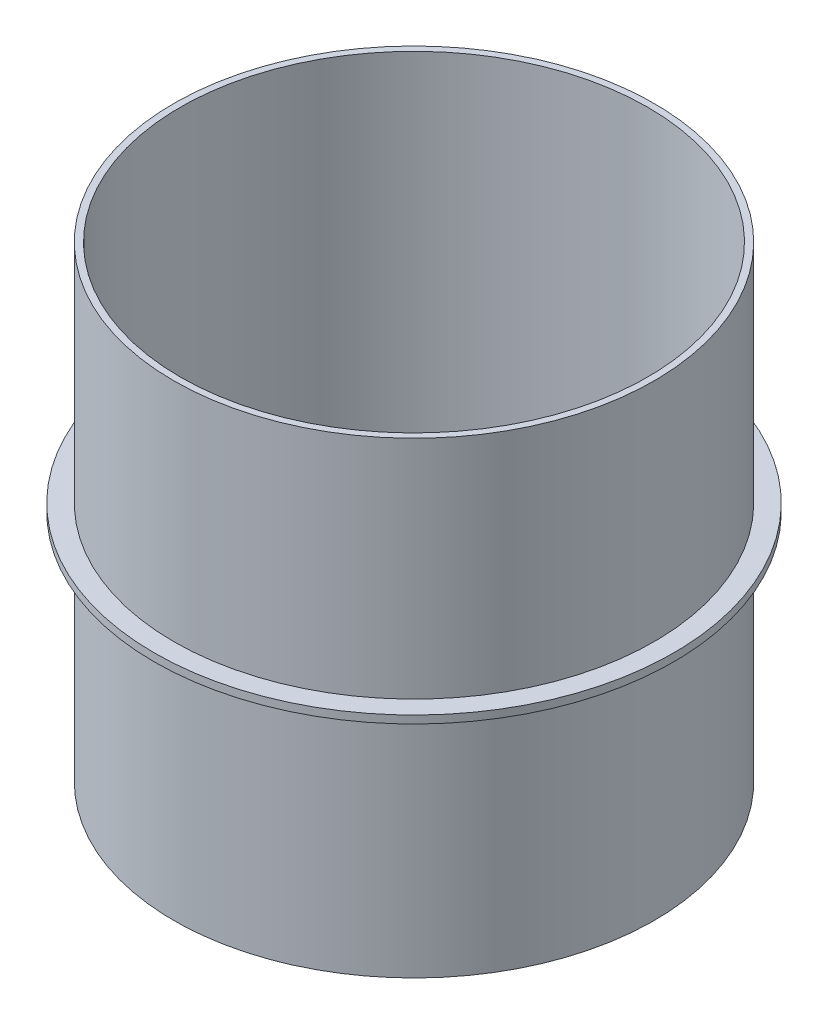
ISO-10303-21;
HEADER;
FILE_DESCRIPTION(('STEP AP214'),'2;1');
FILE_NAME('part.step','',(''),(''),'','','');
FILE_SCHEMA(('AUTOMOTIVE_DESIGN { 1 0 10303 214 1 1 1 1 }'));
ENDSEC;
DATA;
#1=APPLICATION_CONTEXT('core data for automotive mechanical design processes');
#2=APPLICATION_PROTOCOL_DEFINITION('international standard','automotive_design',2000,#1);
#3=PRODUCT_CONTEXT('',#1,'mechanical');
#4=PRODUCT('Part','Part','',(#3));
#5=PRODUCT_RELATED_PRODUCT_CATEGORY('part','',(#4));
#6=PRODUCT_DEFINITION_FORMATION('','',#4);
#7=PRODUCT_DEFINITION_CONTEXT('part definition',#1,'design');
#8=PRODUCT_DEFINITION('design','',#6,#7);
#9=PRODUCT_DEFINITION_SHAPE('','',#8);
#10=(LENGTH_UNIT() NAMED_UNIT(*) SI_UNIT(.MILLI.,.METRE.));
#11=(NAMED_UNIT(*) PLANE_ANGLE_UNIT() SI_UNIT($,.RADIAN.));
#12=(NAMED_UNIT(*) SI_UNIT($,.STERADIAN.) SOLID_ANGLE_UNIT());
#13=UNCERTAINTY_MEASURE_WITH_UNIT(LENGTH_MEASURE(1.E-05),#10,'distance_accuracy_value','');
#14=(GEOMETRIC_REPRESENTATION_CONTEXT(3) GLOBAL_UNCERTAINTY_ASSIGNED_CONTEXT((#13)) GLOBAL_UNIT_ASSIGNED_CONTEXT((#10,
#11,#12)) REPRESENTATION_CONTEXT('',''));
#15=CARTESIAN_POINT('',(0.,0.,0.));
#16=DIRECTION('',(0.,0.,1.));
#17=DIRECTION('',(1.,0.,0.));
#18=AXIS2_PLACEMENT_3D('',#15,#16,#17);
#19=CARTESIAN_POINT('',(0.,0.,0.));
#20=DIRECTION('',(0.,1.,0.));
#21=DIRECTION('',(0.,0.,1.));
#22=AXIS2_PLACEMENT_3D('',#19,#20,#21);
#23=PLANE('',#22);
#24=CARTESIAN_POINT('',(0.,0.,0.));
#25=DIRECTION('',(0.,1.,0.));
#26=DIRECTION('',(0.,0.,1.));
#27=AXIS2_PLACEMENT_3D('',#24,#25,#26);
#28=CIRCLE('',#27,92.5);
#29=CARTESIAN_POINT('',(0.,0.,-92.5));
#30=VERTEX_POINT('',#29);
#31=EDGE_CURVE('E47',#30,#30,#28,.T.);
#32=ORIENTED_EDGE('',*,*,#31,.F.);
#33=EDGE_LOOP('',(#32));
#34=FACE_BOUND('',#33,.T.);
#35=CARTESIAN_POINT('',(0.,0.,0.));
#36=DIRECTION('',(0.,1.,0.));
#37=DIRECTION('',(0.,0.,1.));
#38=AXIS2_PLACEMENT_3D('',#35,#36,#37);
#39=CIRCLE('',#38,90.);
#40=CARTESIAN_POINT('',(0.,0.,-90.));
#41=VERTEX_POINT('',#40);
#42=EDGE_CURVE('E66',#41,#41,#39,.T.);
#43=ORIENTED_EDGE('',*,*,#42,.T.);
#44=EDGE_LOOP('',(#43));
#45=FACE_BOUND('',#44,.T.);
#46=ADVANCED_FACE('F43',(#34,#45),#23,.F.);
#47=CARTESIAN_POINT('',(0.,90.,0.));
#48=DIRECTION('',(0.,-1.,0.));
#49=DIRECTION('',(0.,0.,-1.));
#50=AXIS2_PLACEMENT_3D('',#47,#48,#49);
#51=CYLINDRICAL_SURFACE('',#50,92.5);
#52=CARTESIAN_POINT('',(0.,90.,0.));
#53=DIRECTION('',(0.,1.,0.));
#54=DIRECTION('',(0.,0.,1.));
#55=AXIS2_PLACEMENT_3D('',#52,#53,#54);
#56=CIRCLE('',#55,92.5);
#57=CARTESIAN_POINT('',(0.,90.,-92.5));
#58=VERTEX_POINT('',#57);
#59=EDGE_CURVE('E52',#58,#58,#56,.T.);
#60=CARTESIAN_POINT('',(0.,90.,-92.5));
#61=CARTESIAN_POINT('',(0.,89.0625,-92.5));
#62=CARTESIAN_POINT('',(0.,88.125,-92.5));
#63=CARTESIAN_POINT('',(0.,86.25,-92.5));
#64=CARTESIAN_POINT('',(0.,85.3125,-92.5));
#65=CARTESIAN_POINT('',(0.,83.4375,-92.5));
#66=CARTESIAN_POINT('',(0.,82.5,-92.5));
#67=CARTESIAN_POINT('',(0.,80.625,-92.5));
#68=CARTESIAN_POINT('',(0.,79.6875,-92.5));
#69=CARTESIAN_POINT('',(0.,77.8125,-92.5));
#70=CARTESIAN_POINT('',(0.,76.875,-92.5));
#71=CARTESIAN_POINT('',(0.,75.,-92.5));
#72=CARTESIAN_POINT('',(0.,74.0625,-92.5));
#73=CARTESIAN_POINT('',(0.,72.1875,-92.5));
#74=CARTESIAN_POINT('',(0.,71.25,-92.5));
#75=CARTESIAN_POINT('',(0.,69.375,-92.5));
#76=CARTESIAN_POINT('',(0.,68.4375,-92.5));
#77=CARTESIAN_POINT('',(0.,66.5625,-92.5));
#78=CARTESIAN_POINT('',(0.,65.625,-92.5));
#79=CARTESIAN_POINT('',(0.,63.75,-92.5));
#80=CARTESIAN_POINT('',(0.,62.8125,-92.5));
#81=CARTESIAN_POINT('',(0.,60.9375,-92.5));
#82=CARTESIAN_POINT('',(0.,60.,-92.5));
#83=CARTESIAN_POINT('',(0.,58.125,-92.5));
#84=CARTESIAN_POINT('',(0.,57.1875,-92.5));
#85=CARTESIAN_POINT('',(0.,55.3125,-92.5));
#86=CARTESIAN_POINT('',(0.,54.375,-92.5));
#87=CARTESIAN_POINT('',(0.,52.5,-92.5));
#88=CARTESIAN_POINT('',(0.,51.5625,-92.5));
#89=CARTESIAN_POINT('',(0.,49.6875,-92.5));
#90=CARTESIAN_POINT('',(0.,48.75,-92.5));
#91=CARTESIAN_POINT('',(0.,46.875,-92.5));
#92=CARTESIAN_POINT('',(0.,45.9375,-92.5));
#93=CARTESIAN_POINT('',(0.,44.0625,-92.5));
#94=CARTESIAN_POINT('',(0.,43.125,-92.5));
#95=CARTESIAN_POINT('',(0.,41.25,-92.5));
#96=CARTESIAN_POINT('',(0.,40.3125,-92.5));
#97=CARTESIAN_POINT('',(0.,38.4375,-92.5));
#98=CARTESIAN_POINT('',(0.,37.5,-92.5));
#99=CARTESIAN_POINT('',(0.,35.625,-92.5));
#100=CARTESIAN_POINT('',(0.,34.6875,-92.5));
#101=CARTESIAN_POINT('',(0.,32.8125,-92.5));
#102=CARTESIAN_POINT('',(0.,31.875,-92.5));
#103=CARTESIAN_POINT('',(0.,30.,-92.5));
#104=CARTESIAN_POINT('',(0.,29.0625,-92.5));
#105=CARTESIAN_POINT('',(0.,27.1875,-92.5));
#106=CARTESIAN_POINT('',(0.,26.25,-92.5));
#107=CARTESIAN_POINT('',(0.,24.375,-92.5));
#108=CARTESIAN_POINT('',(0.,23.4375,-92.5));
#109=CARTESIAN_POINT('',(0.,21.5625,-92.5));
#110=CARTESIAN_POINT('',(0.,20.625,-92.5));
#111=CARTESIAN_POINT('',(0.,18.75,-92.5));
#112=CARTESIAN_POINT('',(0.,17.8125,-92.5));
#113=CARTESIAN_POINT('',(0.,15.9375,-92.5));
#114=CARTESIAN_POINT('',(0.,15.,-92.5));
#115=CARTESIAN_POINT('',(0.,13.125,-92.5));
#116=CARTESIAN_POINT('',(0.,12.1875,-92.5));
#117=CARTESIAN_POINT('',(0.,10.3125,-92.5));
#118=CARTESIAN_POINT('',(0.,9.37499999999999,-92.5));
#119=CARTESIAN_POINT('',(0.,7.49999999999999,-92.5));
#120=CARTESIAN_POINT('',(0.,6.56249999999999,-92.5));
#121=CARTESIAN_POINT('',(0.,4.68749999999999,-92.5));
#122=CARTESIAN_POINT('',(0.,3.74999999999998,-92.5));
#123=CARTESIAN_POINT('',(0.,1.87499999999998,-92.5));
#124=CARTESIAN_POINT('',(0.,0.937499999999986,-92.5));
#125=CARTESIAN_POINT('',(0.,0.,-92.5));
#126=B_SPLINE_CURVE_WITH_KNOTS('',3,(#60,#61,#62,#63,#64,#65,#66,#67,#68,#69,#70,#71,#72,#73,
#74,#75,#76,#77,#78,#79,#80,#81,#82,#83,#84,#85,#86,#87,#88,#89,#90,#91,#92,#93,#94,#95,#96,#97,
#98,#99,#100,#101,#102,#103,#104,#105,#106,#107,#108,#109,#110,#111,#112,#113,#114,#115,#116,
#117,#118,#119,#120,#121,#122,#123,#124,#125),.UNSPECIFIED.,.F.,.F.,(4,2,2,2,2,2,2,2,2,2,2,2,2,
2,2,2,2,2,2,2,2,2,2,2,2,2,2,2,2,2,2,2,4),(0.,2.8125,5.62499999999999,8.43749999999999,11.25,
14.0625,16.875,19.6875,22.5,25.3125,28.125,30.9375,33.75,36.5625,39.375,42.1875,45.,47.8125,
50.625,53.4375,56.25,59.0625,61.875,64.6875,67.5,70.3125,73.125,75.9375,78.75,81.5625,84.375,
87.1875,90.),.UNSPECIFIED.);
#127=EDGE_CURVE('BSEAM45',#58,#30,#126,.T.);
#128=ORIENTED_EDGE('',*,*,#59,.F.);
#129=ORIENTED_EDGE('',*,*,#31,.T.);
#130=ORIENTED_EDGE('',*,*,#127,.T.);
#131=ORIENTED_EDGE('',*,*,#127,.F.);
#132=EDGE_LOOP('',(#128,#130,#129,#131));
#133=FACE_BOUND('',#132,.T.);
#134=ADVANCED_FACE('F45',(#133),#51,.T.);
#135=CARTESIAN_POINT('',(0.,90.,0.));
#136=DIRECTION('',(0.,-1.,0.));
#137=DIRECTION('',(0.,0.,-1.));
#138=AXIS2_PLACEMENT_3D('',#135,#136,#137);
#139=CYLINDRICAL_SURFACE('',#138,90.);
#140=CARTESIAN_POINT('',(0.,180.,0.));
#141=DIRECTION('',(0.,1.,0.));
#142=DIRECTION('',(0.,0.,1.));
#143=AXIS2_PLACEMENT_3D('',#140,#141,#142);
#144=CIRCLE('',#143,90.);
#145=CARTESIAN_POINT('',(0.,180.,-90.));
#146=VERTEX_POINT('',#145);
#147=EDGE_CURVE('E113',#146,#146,#144,.T.);
#148=CARTESIAN_POINT('',(0.,0.,-90.));
#149=CARTESIAN_POINT('',(0.,1.87499999999999,-90.));
#150=CARTESIAN_POINT('',(0.,3.74999999999999,-90.));
#151=CARTESIAN_POINT('',(0.,7.49999999999999,-90.));
#152=CARTESIAN_POINT('',(0.,9.37499999999999,-90.));
#153=CARTESIAN_POINT('',(0.,13.125,-90.));
#154=CARTESIAN_POINT('',(0.,15.,-90.));
#155=CARTESIAN_POINT('',(0.,18.75,-90.));
#156=CARTESIAN_POINT('',(0.,20.625,-90.));
#157=CARTESIAN_POINT('',(0.,24.375,-90.));
#158=CARTESIAN_POINT('',(0.,26.25,-90.));
#159=CARTESIAN_POINT('',(0.,30.,-90.));
#160=CARTESIAN_POINT('',(0.,31.875,-90.));
#161=CARTESIAN_POINT('',(0.,35.625,-90.));
#162=CARTESIAN_POINT('',(0.,37.5,-90.));
#163=CARTESIAN_POINT('',(0.,41.25,-90.));
#164=CARTESIAN_POINT('',(0.,43.125,-90.));
#165=CARTESIAN_POINT('',(0.,46.875,-90.));
#166=CARTESIAN_POINT('',(0.,48.75,-90.));
#167=CARTESIAN_POINT('',(0.,52.5,-90.));
#168=CARTESIAN_POINT('',(0.,54.375,-90.));
#169=CARTESIAN_POINT('',(0.,58.125,-90.));
#170=CARTESIAN_POINT('',(0.,60.,-90.));
#171=CARTESIAN_POINT('',(0.,63.75,-90.));
#172=CARTESIAN_POINT('',(0.,65.625,-90.));
#173=CARTESIAN_POINT('',(0.,69.375,-90.));
#174=CARTESIAN_POINT('',(0.,71.25,-90.));
#175=CARTESIAN_POINT('',(0.,75.,-90.));
#176=CARTESIAN_POINT('',(0.,76.875,-90.));
#177=CARTESIAN_POINT('',(0.,80.625,-90.));
#178=CARTESIAN_POINT('',(0.,82.5,-90.));
#179=CARTESIAN_POINT('',(0.,86.25,-90.));
#180=CARTESIAN_POINT('',(0.,88.125,-90.));
#181=CARTESIAN_POINT('',(0.,91.875,-90.));
#182=CARTESIAN_POINT('',(0.,93.75,-90.));
#183=CARTESIAN_POINT('',(0.,97.5,-90.));
#184=CARTESIAN_POINT('',(0.,99.375,-90.));
#185=CARTESIAN_POINT('',(0.,103.125,-90.));
#186=CARTESIAN_POINT('',(0.,105.,-90.));
#187=CARTESIAN_POINT('',(0.,108.75,-90.));
#188=CARTESIAN_POINT('',(0.,110.625,-90.));
#189=CARTESIAN_POINT('',(0.,114.375,-90.));
#190=CARTESIAN_POINT('',(0.,116.25,-90.));
#191=CARTESIAN_POINT('',(0.,120.,-90.));
#192=CARTESIAN_POINT('',(0.,121.875,-90.));
#193=CARTESIAN_POINT('',(0.,125.625,-90.));
#194=CARTESIAN_POINT('',(0.,127.5,-90.));
#195=CARTESIAN_POINT('',(0.,131.25,-90.));
#196=CARTESIAN_POINT('',(0.,133.125,-90.));
#197=CARTESIAN_POINT('',(0.,136.875,-90.));
#198=CARTESIAN_POINT('',(0.,138.75,-90.));
#199=CARTESIAN_POINT('',(0.,142.5,-90.));
#200=CARTESIAN_POINT('',(0.,144.375,-90.));
#201=CARTESIAN_POINT('',(0.,148.125,-90.));
#202=CARTESIAN_POINT('',(0.,150.,-90.));
#203=CARTESIAN_POINT('',(0.,153.75,-90.));
#204=CARTESIAN_POINT('',(0.,155.625,-90.));
#205=CARTESIAN_POINT('',(0.,159.375,-90.));
#206=CARTESIAN_POINT('',(0.,161.25,-90.));
#207=CARTESIAN_POINT('',(0.,165.,-90.));
#208=CARTESIAN_POINT('',(0.,166.875,-90.));
#209=CARTESIAN_POINT('',(0.,170.625,-90.));
#210=CARTESIAN_POINT('',(0.,172.5,-90.));
#211=CARTESIAN_POINT('',(0.,176.25,-90.));
#212=CARTESIAN_POINT('',(0.,178.125,-90.));
#213=CARTESIAN_POINT('',(0.,180.,-90.));
#214=B_SPLINE_CURVE_WITH_KNOTS('',3,(#148,#149,#150,#151,#152,#153,#154,#155,#156,#157,#158,
#159,#160,#161,#162,#163,#164,#165,#166,#167,#168,#169,#170,#171,#172,#173,#174,#175,#176,#177,
#178,#179,#180,#181,#182,#183,#184,#185,#186,#187,#188,#189,#190,#191,#192,#193,#194,#195,#196,
#197,#198,#199,#200,#201,#202,#203,#204,#205,#206,#207,#208,#209,#210,#211,#212,#213),
.UNSPECIFIED.,.F.,.F.,(4,2,2,2,2,2,2,2,2,2,2,2,2,2,2,2,2,2,2,2,2,2,2,2,2,2,2,2,2,2,2,2,4),(0.,
5.62500000000001,11.25,16.875,22.5,28.125,33.75,39.375,45.,50.625,56.25,61.875,67.5,73.125,
78.75,84.375,90.,95.625,101.25,106.875,112.5,118.125,123.75,129.375,135.,140.625,146.25,151.875,
157.5,163.125,168.75,174.375,180.),.UNSPECIFIED.);
#215=EDGE_CURVE('BSEAM84',#41,#146,#214,.T.);
#216=ORIENTED_EDGE('',*,*,#42,.F.);
#217=ORIENTED_EDGE('',*,*,#147,.T.);
#218=ORIENTED_EDGE('',*,*,#215,.T.);
#219=ORIENTED_EDGE('',*,*,#215,.F.);
#220=EDGE_LOOP('',(#216,#218,#217,#219));
#221=FACE_BOUND('',#220,.T.);
#222=ADVANCED_FACE('F84',(#221),#139,.F.);
#223=CARTESIAN_POINT('',(0.,93.,0.));
#224=DIRECTION('',(0.,1.,0.));
#225=DIRECTION('',(0.,0.,1.));
#226=AXIS2_PLACEMENT_3D('',#223,#224,#225);
#227=PLANE('',#226);
#228=CARTESIAN_POINT('',(0.,93.,0.));
#229=DIRECTION('',(0.,1.,0.));
#230=DIRECTION('',(0.,0.,1.));
#231=AXIS2_PLACEMENT_3D('',#228,#229,#230);
#232=CIRCLE('',#231,92.5);
#233=CARTESIAN_POINT('',(0.,93.,92.5));
#234=VERTEX_POINT('',#233);
#235=EDGE_CURVE('E10',#234,#234,#232,.T.);
#236=ORIENTED_EDGE('',*,*,#235,.F.);
#237=EDGE_LOOP('',(#236));
#238=FACE_BOUND('',#237,.T.);
#239=CARTESIAN_POINT('',(0.,93.,0.));
#240=DIRECTION('',(0.,1.,0.));
#241=DIRECTION('',(0.,0.,1.));
#242=AXIS2_PLACEMENT_3D('',#239,#240,#241);
#243=CIRCLE('',#242,100.);
#244=CARTESIAN_POINT('',(0.,93.,100.));
#245=VERTEX_POINT('',#244);
#246=EDGE_CURVE('E62',#245,#245,#243,.T.);
#247=ORIENTED_EDGE('',*,*,#246,.T.);
#248=EDGE_LOOP('',(#247));
#249=FACE_BOUND('',#248,.T.);
#250=ADVANCED_FACE('F89',(#238,#249),#227,.T.);
#251=CARTESIAN_POINT('',(0.,90.,0.));
#252=DIRECTION('',(0.,1.,0.));
#253=DIRECTION('',(0.,0.,1.));
#254=AXIS2_PLACEMENT_3D('',#251,#252,#253);
#255=PLANE('',#254);
#256=ORIENTED_EDGE('',*,*,#59,.T.);
#257=EDGE_LOOP('',(#256));
#258=FACE_BOUND('',#257,.T.);
#259=CARTESIAN_POINT('',(0.,90.,0.));
#260=DIRECTION('',(0.,1.,0.));
#261=DIRECTION('',(0.,0.,1.));
#262=AXIS2_PLACEMENT_3D('',#259,#260,#261);
#263=CIRCLE('',#262,100.);
#264=CARTESIAN_POINT('',(0.,90.,100.));
#265=VERTEX_POINT('',#264);
#266=EDGE_CURVE('E67',#265,#265,#263,.T.);
#267=ORIENTED_EDGE('',*,*,#266,.F.);
#268=EDGE_LOOP('',(#267));
#269=FACE_BOUND('',#268,.T.);
#270=ADVANCED_FACE('F95',(#258,#269),#255,.F.);
#271=CARTESIAN_POINT('',(0.,93.,0.));
#272=DIRECTION('',(0.,-1.,0.));
#273=DIRECTION('',(0.,0.,-1.));
#274=AXIS2_PLACEMENT_3D('',#271,#272,#273);
#275=CYLINDRICAL_SURFACE('',#274,100.);
#276=ORIENTED_EDGE('',*,*,#246,.F.);
#277=EDGE_LOOP('',(#276));
#278=FACE_BOUND('',#277,.T.);
#279=ORIENTED_EDGE('',*,*,#266,.T.);
#280=EDGE_LOOP('',(#279));
#281=FACE_BOUND('',#280,.T.);
#282=ADVANCED_FACE('F91',(#278,#281),#275,.T.);
#283=CARTESIAN_POINT('',(0.,90.,0.));
#284=DIRECTION('',(0.,1.,0.));
#285=DIRECTION('',(0.,0.,1.));
#286=AXIS2_PLACEMENT_3D('',#283,#284,#285);
#287=CYLINDRICAL_SURFACE('',#286,92.5);
#288=CARTESIAN_POINT('',(0.,180.,0.));
#289=DIRECTION('',(0.,1.,0.));
#290=DIRECTION('',(0.,0.,1.));
#291=AXIS2_PLACEMENT_3D('',#288,#289,#290);
#292=CIRCLE('',#291,92.5);
#293=CARTESIAN_POINT('',(0.,180.,92.5));
#294=VERTEX_POINT('',#293);
#295=EDGE_CURVE('E60',#294,#294,#292,.T.);
#296=CARTESIAN_POINT('',(0.,93.,92.5));
#297=CARTESIAN_POINT('',(0.,93.90625,92.5));
#298=CARTESIAN_POINT('',(0.,94.8125,92.5));
#299=CARTESIAN_POINT('',(0.,96.625,92.5));
#300=CARTESIAN_POINT('',(0.,97.53125,92.5));
#301=CARTESIAN_POINT('',(0.,99.34375,92.5));
#302=CARTESIAN_POINT('',(0.,100.25,92.5));
#303=CARTESIAN_POINT('',(0.,102.0625,92.5));
#304=CARTESIAN_POINT('',(0.,102.96875,92.5));
#305=CARTESIAN_POINT('',(0.,104.78125,92.5));
#306=CARTESIAN_POINT('',(0.,105.6875,92.5));
#307=CARTESIAN_POINT('',(0.,107.5,92.5));
#308=CARTESIAN_POINT('',(0.,108.40625,92.5));
#309=CARTESIAN_POINT('',(0.,110.21875,92.5));
#310=CARTESIAN_POINT('',(0.,111.125,92.5));
#311=CARTESIAN_POINT('',(0.,112.9375,92.5));
#312=CARTESIAN_POINT('',(0.,113.84375,92.5));
#313=CARTESIAN_POINT('',(0.,115.65625,92.5));
#314=CARTESIAN_POINT('',(0.,116.5625,92.5));
#315=CARTESIAN_POINT('',(0.,118.375,92.5));
#316=CARTESIAN_POINT('',(0.,119.28125,92.5));
#317=CARTESIAN_POINT('',(0.,121.09375,92.5));
#318=CARTESIAN_POINT('',(0.,122.,92.5));
#319=CARTESIAN_POINT('',(0.,123.8125,92.5));
#320=CARTESIAN_POINT('',(0.,124.71875,92.5));
#321=CARTESIAN_POINT('',(0.,126.53125,92.5));
#322=CARTESIAN_POINT('',(0.,127.4375,92.5));
#323=CARTESIAN_POINT('',(0.,129.25,92.5));
#324=CARTESIAN_POINT('',(0.,130.15625,92.5));
#325=CARTESIAN_POINT('',(0.,131.96875,92.5));
#326=CARTESIAN_POINT('',(0.,132.875,92.5));
#327=CARTESIAN_POINT('',(0.,134.6875,92.5));
#328=CARTESIAN_POINT('',(0.,135.59375,92.5));
#329=CARTESIAN_POINT('',(0.,137.40625,92.5));
#330=CARTESIAN_POINT('',(0.,138.3125,92.5));
#331=CARTESIAN_POINT('',(0.,140.125,92.5));
#332=CARTESIAN_POINT('',(0.,141.03125,92.5));
#333=CARTESIAN_POINT('',(0.,142.84375,92.5));
#334=CARTESIAN_POINT('',(0.,143.75,92.5));
#335=CARTESIAN_POINT('',(0.,145.5625,92.5));
#336=CARTESIAN_POINT('',(0.,146.46875,92.5));
#337=CARTESIAN_POINT('',(0.,148.28125,92.5));
#338=CARTESIAN_POINT('',(0.,149.1875,92.5));
#339=CARTESIAN_POINT('',(0.,151.,92.5));
#340=CARTESIAN_POINT('',(0.,151.90625,92.5));
#341=CARTESIAN_POINT('',(0.,153.71875,92.5));
#342=CARTESIAN_POINT('',(0.,154.625,92.5));
#343=CARTESIAN_POINT('',(0.,156.4375,92.5));
#344=CARTESIAN_POINT('',(0.,157.34375,92.5));
#345=CARTESIAN_POINT('',(0.,159.15625,92.5));
#346=CARTESIAN_POINT('',(0.,160.0625,92.5));
#347=CARTESIAN_POINT('',(0.,161.875,92.5));
#348=CARTESIAN_POINT('',(0.,162.78125,92.5));
#349=CARTESIAN_POINT('',(0.,164.59375,92.5));
#350=CARTESIAN_POINT('',(0.,165.5,92.5));
#351=CARTESIAN_POINT('',(0.,167.3125,92.5));
#352=CARTESIAN_POINT('',(0.,168.21875,92.5));
#353=CARTESIAN_POINT('',(0.,170.03125,92.5));
#354=CARTESIAN_POINT('',(0.,170.9375,92.5));
#355=CARTESIAN_POINT('',(0.,172.75,92.5));
#356=CARTESIAN_POINT('',(0.,173.65625,92.5));
#357=CARTESIAN_POINT('',(0.,175.46875,92.5));
#358=CARTESIAN_POINT('',(0.,176.375,92.5));
#359=CARTESIAN_POINT('',(0.,178.1875,92.5));
#360=CARTESIAN_POINT('',(0.,179.09375,92.5));
#361=CARTESIAN_POINT('',(0.,180.,92.5));
#362=B_SPLINE_CURVE_WITH_KNOTS('',3,(#296,#297,#298,#299,#300,#301,#302,#303,#304,#305,#306,
#307,#308,#309,#310,#311,#312,#313,#314,#315,#316,#317,#318,#319,#320,#321,#322,#323,#324,#325,
#326,#327,#328,#329,#330,#331,#332,#333,#334,#335,#336,#337,#338,#339,#340,#341,#342,#343,#344,
#345,#346,#347,#348,#349,#350,#351,#352,#353,#354,#355,#356,#357,#358,#359,#360,#361),
.UNSPECIFIED.,.F.,.F.,(4,2,2,2,2,2,2,2,2,2,2,2,2,2,2,2,2,2,2,2,2,2,2,2,2,2,2,2,2,2,2,2,4),(0.,
2.71875000000001,5.4375,8.15625,10.875,13.59375,16.3125,19.03125,21.75,24.46875,27.1875,
29.90625,32.625,35.34375,38.0625,40.78125,43.5,46.21875,48.9375,51.65625,54.375,57.09375,
59.8125,62.53125,65.25,67.96875,70.6875,73.40625,76.125,78.84375,81.5625,84.28125,87.),.UNSPECIFIED.);
#363=EDGE_CURVE('BSEAM94',#234,#294,#362,.T.);
#364=ORIENTED_EDGE('',*,*,#235,.T.);
#365=ORIENTED_EDGE('',*,*,#295,.F.);
#366=ORIENTED_EDGE('',*,*,#363,.T.);
#367=ORIENTED_EDGE('',*,*,#363,.F.);
#368=EDGE_LOOP('',(#364,#366,#365,#367));
#369=FACE_BOUND('',#368,.T.);
#370=ADVANCED_FACE('F94',(#369),#287,.T.);
#371=CARTESIAN_POINT('',(0.,180.,0.));
#372=DIRECTION('',(0.,-1.,0.));
#373=DIRECTION('',(0.,0.,1.));
#374=AXIS2_PLACEMENT_3D('',#371,#372,#373);
#375=PLANE('',#374);
#376=ORIENTED_EDGE('',*,*,#147,.F.);
#377=EDGE_LOOP('',(#376));
#378=FACE_BOUND('',#377,.T.);
#379=ORIENTED_EDGE('',*,*,#295,.T.);
#380=EDGE_LOOP('',(#379));
#381=FACE_BOUND('',#380,.T.);
#382=ADVANCED_FACE('F105',(#378,#381),#375,.F.);
#383=CLOSED_SHELL('',(#46,#134,#222,#250,#270,#282,#370,#382));
#384=MANIFOLD_SOLID_BREP('B2',#383);
#385=ADVANCED_BREP_SHAPE_REPRESENTATION('',(#18,#384),#14);
#386=SHAPE_DEFINITION_REPRESENTATION(#9,#385);
ENDSEC;
END-ISO-10303-21;
